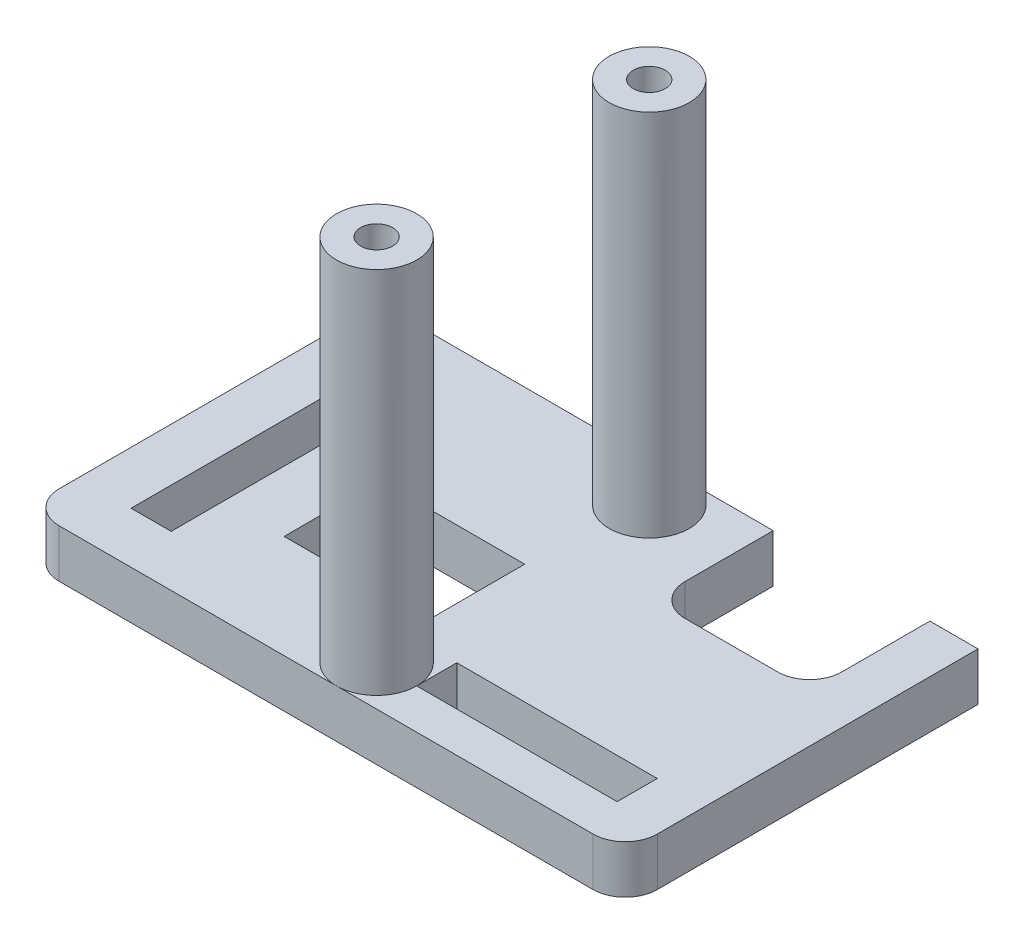
ISO-10303-21;
HEADER;
FILE_DESCRIPTION(('STEP AP214'),'2;1');
FILE_NAME('part.step','',(''),(''),'','','');
FILE_SCHEMA(('AUTOMOTIVE_DESIGN { 1 0 10303 214 1 1 1 1 }'));
ENDSEC;
DATA;
#1=APPLICATION_CONTEXT('core data for automotive mechanical design processes');
#2=APPLICATION_PROTOCOL_DEFINITION('international standard','automotive_design',2000,#1);
#3=PRODUCT_CONTEXT('',#1,'mechanical');
#4=PRODUCT('Part','Part','',(#3));
#5=PRODUCT_RELATED_PRODUCT_CATEGORY('part','',(#4));
#6=PRODUCT_DEFINITION_FORMATION('','',#4);
#7=PRODUCT_DEFINITION_CONTEXT('part definition',#1,'design');
#8=PRODUCT_DEFINITION('design','',#6,#7);
#9=PRODUCT_DEFINITION_SHAPE('','',#8);
#10=(LENGTH_UNIT() NAMED_UNIT(*) SI_UNIT(.MILLI.,.METRE.));
#11=(NAMED_UNIT(*) PLANE_ANGLE_UNIT() SI_UNIT($,.RADIAN.));
#12=(NAMED_UNIT(*) SI_UNIT($,.STERADIAN.) SOLID_ANGLE_UNIT());
#13=UNCERTAINTY_MEASURE_WITH_UNIT(LENGTH_MEASURE(1.E-05),#10,'distance_accuracy_value','');
#14=(GEOMETRIC_REPRESENTATION_CONTEXT(3) GLOBAL_UNCERTAINTY_ASSIGNED_CONTEXT((#13)) GLOBAL_UNIT_ASSIGNED_CONTEXT((#10,
#11,#12)) REPRESENTATION_CONTEXT('',''));
#15=CARTESIAN_POINT('',(0.,0.,0.));
#16=DIRECTION('',(0.,0.,1.));
#17=DIRECTION('',(1.,0.,0.));
#18=AXIS2_PLACEMENT_3D('',#15,#16,#17);
#19=CARTESIAN_POINT('',(0.,3.,0.));
#20=DIRECTION('',(0.,1.,0.));
#21=DIRECTION('',(0.,0.,1.));
#22=AXIS2_PLACEMENT_3D('',#19,#20,#21);
#23=PLANE('',#22);
#24=DIRECTION('',(1.,0.,0.));
#25=VECTOR('',#24,1.);
#26=CARTESIAN_POINT('',(0.,3.,18.9400374848537));
#27=LINE('',#26,#25);
#28=CARTESIAN_POINT('',(-35.2702207310731,3.,18.9400374848537));
#29=VERTEX_POINT('',#28);
#30=CARTESIAN_POINT('',(-32.7702207310731,3.,18.9400374848537));
#31=VERTEX_POINT('',#30);
#32=EDGE_CURVE('E272',#29,#31,#27,.T.);
#33=ORIENTED_EDGE('',*,*,#32,.T.);
#34=DIRECTION('',(0.,0.,1.));
#35=VECTOR('',#34,1.);
#36=CARTESIAN_POINT('',(-32.7702207310731,3.,0.));
#37=LINE('',#36,#35);
#38=CARTESIAN_POINT('',(-32.7702207310731,3.,31.4400374848537));
#39=VERTEX_POINT('',#38);
#40=EDGE_CURVE('E275',#31,#39,#37,.T.);
#41=ORIENTED_EDGE('',*,*,#40,.T.);
#42=DIRECTION('',(1.,0.,0.));
#43=VECTOR('',#42,1.);
#44=CARTESIAN_POINT('',(0.,3.,31.4400374848537));
#45=LINE('',#44,#43);
#46=CARTESIAN_POINT('',(-35.2702207310731,3.,31.4400374848537));
#47=VERTEX_POINT('',#46);
#48=EDGE_CURVE('E277',#47,#39,#45,.T.);
#49=ORIENTED_EDGE('',*,*,#48,.F.);
#50=DIRECTION('',(0.,0.,1.));
#51=VECTOR('',#50,1.);
#52=CARTESIAN_POINT('',(-35.2702207310731,3.,0.));
#53=LINE('',#52,#51);
#54=EDGE_CURVE('E280',#29,#47,#53,.T.);
#55=ORIENTED_EDGE('',*,*,#54,.F.);
#56=EDGE_LOOP('',(#33,#41,#49,#55));
#57=FACE_BOUND('',#56,.T.);
#58=DIRECTION('',(0.,0.,-1.));
#59=VECTOR('',#58,1.);
#60=CARTESIAN_POINT('',(-19.9759075065072,3.,0.));
#61=LINE('',#60,#59);
#62=CARTESIAN_POINT('',(-19.9759075065072,3.,28.1900374848538));
#63=VERTEX_POINT('',#62);
#64=CARTESIAN_POINT('',(-19.9759075065072,3.,22.1900374848537));
#65=VERTEX_POINT('',#64);
#66=EDGE_CURVE('E283',#63,#65,#61,.T.);
#67=ORIENTED_EDGE('',*,*,#66,.F.);
#68=DIRECTION('',(1.,0.,0.));
#69=VECTOR('',#68,1.);
#70=CARTESIAN_POINT('',(0.,3.,28.1900374848538));
#71=LINE('',#70,#69);
#72=CARTESIAN_POINT('',(-28.9759075065072,3.,28.1900374848537));
#73=VERTEX_POINT('',#72);
#74=EDGE_CURVE('E286',#73,#63,#71,.T.);
#75=ORIENTED_EDGE('',*,*,#74,.F.);
#76=DIRECTION('',(0.,0.,-1.));
#77=VECTOR('',#76,1.);
#78=CARTESIAN_POINT('',(-28.9759075065072,3.,0.));
#79=LINE('',#78,#77);
#80=CARTESIAN_POINT('',(-28.9759075065072,3.,22.1900374848537));
#81=VERTEX_POINT('',#80);
#82=EDGE_CURVE('E289',#73,#81,#79,.T.);
#83=ORIENTED_EDGE('',*,*,#82,.T.);
#84=DIRECTION('',(1.,0.,0.));
#85=VECTOR('',#84,1.);
#86=CARTESIAN_POINT('',(0.,3.,22.1900374848537));
#87=LINE('',#86,#85);
#88=EDGE_CURVE('E292',#81,#65,#87,.T.);
#89=ORIENTED_EDGE('',*,*,#88,.T.);
#90=EDGE_LOOP('',(#67,#75,#83,#89));
#91=FACE_BOUND('',#90,.T.);
#92=DIRECTION('',(1.,0.,0.));
#93=VECTOR('',#92,1.);
#94=CARTESIAN_POINT('',(0.,3.,34.6300374848537));
#95=LINE('',#94,#93);
#96=CARTESIAN_POINT('',(-36.561763485987,3.,34.6300374848537));
#97=VERTEX_POINT('',#96);
#98=CARTESIAN_POINT('',(-19.2702207310731,3.,34.6300374848537));
#99=VERTEX_POINT('',#98);
#100=EDGE_CURVE('E216',#97,#99,#95,.T.);
#101=ORIENTED_EDGE('',*,*,#100,.T.);
#102=CARTESIAN_POINT('',(-19.2702207310731,3.,32.1300374848537));
#103=DIRECTION('',(0.,1.,0.));
#104=DIRECTION('',(0.,0.,1.));
#105=AXIS2_PLACEMENT_3D('',#102,#103,#104);
#106=CIRCLE('',#105,2.5);
#107=CARTESIAN_POINT('',(-16.7702207310731,3.00000000000001,32.1300374848537));
#108=VERTEX_POINT('',#107);
#109=EDGE_CURVE('E48',#99,#108,#106,.F.);
#110=ORIENTED_EDGE('',*,*,#109,.T.);
#111=DIRECTION('',(0.,0.,-1.));
#112=VECTOR('',#111,1.);
#113=CARTESIAN_POINT('',(-16.7702207310731,3.,0.));
#114=LINE('',#113,#112);
#115=CARTESIAN_POINT('',(-16.7702207310731,3.,29.6300374848537));
#116=VERTEX_POINT('',#115);
#117=EDGE_CURVE('E213',#108,#116,#114,.T.);
#118=ORIENTED_EDGE('',*,*,#117,.T.);
#119=DIRECTION('',(1.,0.,0.));
#120=VECTOR('',#119,1.);
#121=CARTESIAN_POINT('',(0.,3.,29.6300374848537));
#122=LINE('',#121,#120);
#123=CARTESIAN_POINT('',(-4.2702207310731,3.,29.6300374848537));
#124=VERTEX_POINT('',#123);
#125=EDGE_CURVE('E235',#116,#124,#122,.T.);
#126=ORIENTED_EDGE('',*,*,#125,.T.);
#127=DIRECTION('',(0.,0.,-1.));
#128=VECTOR('',#127,1.);
#129=CARTESIAN_POINT('',(-4.2702207310731,3.,0.));
#130=LINE('',#129,#128);
#131=CARTESIAN_POINT('',(-4.2702207310731,3.,32.1300374848537));
#132=VERTEX_POINT('',#131);
#133=EDGE_CURVE('E238',#132,#124,#130,.T.);
#134=ORIENTED_EDGE('',*,*,#133,.F.);
#135=DIRECTION('',(1.,0.,0.));
#136=VECTOR('',#135,1.);
#137=CARTESIAN_POINT('',(0.,3.,32.1300374848537));
#138=LINE('',#137,#136);
#139=EDGE_CURVE('E223',#108,#132,#138,.T.);
#140=ORIENTED_EDGE('',*,*,#139,.F.);
#141=EDGE_CURVE('E202',#108,#99,#106,.F.);
#142=ORIENTED_EDGE('',*,*,#141,.T.);
#143=CARTESIAN_POINT('',(-3.2702207310731,3.,34.6300374848537));
#144=VERTEX_POINT('',#143);
#145=EDGE_CURVE('E256',#99,#144,#95,.T.);
#146=ORIENTED_EDGE('',*,*,#145,.T.);
#147=CARTESIAN_POINT('',(-3.2702207310731,3.,32.6300374848537));
#148=DIRECTION('',(0.,1.,0.));
#149=DIRECTION('',(0.,0.,1.));
#150=AXIS2_PLACEMENT_3D('',#147,#148,#149);
#151=CIRCLE('',#150,2.);
#152=CARTESIAN_POINT('',(-1.2702207310731,3.,32.6300374848537));
#153=VERTEX_POINT('',#152);
#154=EDGE_CURVE('E398',#144,#153,#151,.T.);
#155=ORIENTED_EDGE('',*,*,#154,.T.);
#156=DIRECTION('',(0.,0.,1.));
#157=VECTOR('',#156,1.);
#158=CARTESIAN_POINT('',(-1.2702207310731,3.,0.));
#159=LINE('',#158,#157);
#160=CARTESIAN_POINT('',(-1.2702207310731,3.,12.6300374848537));
#161=VERTEX_POINT('',#160);
#162=EDGE_CURVE('E258',#161,#153,#159,.T.);
#163=ORIENTED_EDGE('',*,*,#162,.F.);
#164=DIRECTION('',(1.,0.,0.));
#165=VECTOR('',#164,1.);
#166=CARTESIAN_POINT('',(0.,3.,12.6300374848537));
#167=LINE('',#166,#165);
#168=CARTESIAN_POINT('',(-4.2702207310731,3.,12.6300374848537));
#169=VERTEX_POINT('',#168);
#170=EDGE_CURVE('E261',#169,#161,#167,.T.);
#171=ORIENTED_EDGE('',*,*,#170,.F.);
#172=DIRECTION('',(0.,0.,-1.));
#173=VECTOR('',#172,1.);
#174=CARTESIAN_POINT('',(-4.2702207310731,3.,0.));
#175=LINE('',#174,#173);
#176=CARTESIAN_POINT('',(-4.2702207310731,3.,18.1214427198825));
#177=VERTEX_POINT('',#176);
#178=EDGE_CURVE('E264',#177,#169,#175,.T.);
#179=ORIENTED_EDGE('',*,*,#178,.F.);
#180=CARTESIAN_POINT('',(-6.2702207310731,3.,18.1214427198825));
#181=DIRECTION('',(0.,1.,0.));
#182=DIRECTION('',(0.,0.,1.));
#183=AXIS2_PLACEMENT_3D('',#180,#181,#182);
#184=CIRCLE('',#183,2.);
#185=CARTESIAN_POINT('',(-6.2702207310731,3.,20.1214427198825));
#186=VERTEX_POINT('',#185);
#187=EDGE_CURVE('E415',#177,#186,#184,.F.);
#188=ORIENTED_EDGE('',*,*,#187,.T.);
#189=DIRECTION('',(-1.,0.,0.));
#190=VECTOR('',#189,1.);
#191=CARTESIAN_POINT('',(0.,3.,20.1214427198825));
#192=LINE('',#191,#190);
#193=CARTESIAN_POINT('',(-12.0414444487504,3.,20.1214427198825));
#194=VERTEX_POINT('',#193);
#195=EDGE_CURVE('E266',#186,#194,#192,.T.);
#196=ORIENTED_EDGE('',*,*,#195,.T.);
#197=CARTESIAN_POINT('',(-12.0414444487504,3.,18.1214427198825));
#198=DIRECTION('',(0.,1.,0.));
#199=DIRECTION('',(0.,0.,1.));
#200=AXIS2_PLACEMENT_3D('',#197,#198,#199);
#201=CIRCLE('',#200,2.);
#202=CARTESIAN_POINT('',(-14.0414444487504,3.,18.1214427198825));
#203=VERTEX_POINT('',#202);
#204=EDGE_CURVE('E11',#194,#203,#201,.F.);
#205=ORIENTED_EDGE('',*,*,#204,.T.);
#206=DIRECTION('',(0.,0.,1.));
#207=VECTOR('',#206,1.);
#208=CARTESIAN_POINT('',(-14.0414444487504,3.,0.));
#209=LINE('',#208,#207);
#210=CARTESIAN_POINT('',(-14.0414444487504,3.,12.6300374848537));
#211=VERTEX_POINT('',#210);
#212=EDGE_CURVE('E269',#211,#203,#209,.T.);
#213=ORIENTED_EDGE('',*,*,#212,.F.);
#214=DIRECTION('',(1.,0.,0.));
#215=VECTOR('',#214,1.);
#216=CARTESIAN_POINT('',(0.,3.,12.6300374848537));
#217=LINE('',#216,#215);
#218=CARTESIAN_POINT('',(-19.2702207310731,3.,12.6300374848537));
#219=VERTEX_POINT('',#218);
#220=EDGE_CURVE('E249',#219,#211,#217,.T.);
#221=ORIENTED_EDGE('',*,*,#220,.F.);
#222=CARTESIAN_POINT('',(-19.2702207310731,3.,15.1300374848537));
#223=DIRECTION('',(0.,1.,0.));
#224=DIRECTION('',(0.,0.,1.));
#225=AXIS2_PLACEMENT_3D('',#222,#223,#224);
#226=CIRCLE('',#225,2.5);
#227=EDGE_CURVE('E54',#219,#219,#226,.F.);
#228=ORIENTED_EDGE('',*,*,#227,.T.);
#229=CARTESIAN_POINT('',(-36.561763485987,3.,12.6300374848537));
#230=VERTEX_POINT('',#229);
#231=EDGE_CURVE('E250',#230,#219,#217,.T.);
#232=ORIENTED_EDGE('',*,*,#231,.F.);
#233=CARTESIAN_POINT('',(-36.561763485987,3.,14.6300374848537));
#234=DIRECTION('',(0.,1.,0.));
#235=DIRECTION('',(0.,0.,1.));
#236=AXIS2_PLACEMENT_3D('',#233,#234,#235);
#237=CIRCLE('',#236,2.);
#238=CARTESIAN_POINT('',(-38.561763485987,3.,14.6300374848537));
#239=VERTEX_POINT('',#238);
#240=EDGE_CURVE('E402',#230,#239,#237,.T.);
#241=ORIENTED_EDGE('',*,*,#240,.T.);
#242=DIRECTION('',(0.,0.,1.));
#243=VECTOR('',#242,1.);
#244=CARTESIAN_POINT('',(-38.561763485987,3.,0.));
#245=LINE('',#244,#243);
#246=CARTESIAN_POINT('',(-38.561763485987,3.,32.6300374848537));
#247=VERTEX_POINT('',#246);
#248=EDGE_CURVE('E253',#239,#247,#245,.T.);
#249=ORIENTED_EDGE('',*,*,#248,.T.);
#250=CARTESIAN_POINT('',(-36.561763485987,3.,32.6300374848537));
#251=DIRECTION('',(0.,1.,0.));
#252=DIRECTION('',(0.,0.,1.));
#253=AXIS2_PLACEMENT_3D('',#250,#251,#252);
#254=CIRCLE('',#253,2.);
#255=EDGE_CURVE('E400',#247,#97,#254,.T.);
#256=ORIENTED_EDGE('',*,*,#255,.T.);
#257=EDGE_LOOP('',(#101,#110,#118,#126,#134,#140,#142,#146,#155,#163,#171,#179,#188,#196,#205,
#213,#221,#228,#232,#241,#249,#256));
#258=FACE_BOUND('',#257,.T.);
#259=ADVANCED_FACE('F34',(#57,#91,#258),#23,.T.);
#260=CARTESIAN_POINT('',(-19.9759075065072,3.,0.));
#261=DIRECTION('',(-1.,0.,0.));
#262=DIRECTION('',(0.,0.,1.));
#263=AXIS2_PLACEMENT_3D('',#260,#261,#262);
#264=PLANE('',#263);
#265=DIRECTION('',(0.,0.,-1.));
#266=VECTOR('',#265,1.);
#267=CARTESIAN_POINT('',(-19.9759075065072,0.,0.));
#268=LINE('',#267,#266);
#269=CARTESIAN_POINT('',(-19.9759075065072,0.,28.1900374848538));
#270=VERTEX_POINT('',#269);
#271=CARTESIAN_POINT('',(-19.9759075065072,0.,22.1900374848537));
#272=VERTEX_POINT('',#271);
#273=EDGE_CURVE('E337',#270,#272,#268,.T.);
#274=ORIENTED_EDGE('',*,*,#273,.F.);
#275=DIRECTION('',(0.,-1.,0.));
#276=VECTOR('',#275,1.);
#277=CARTESIAN_POINT('',(-19.9759075065072,3.,28.1900374848538));
#278=LINE('',#277,#276);
#279=EDGE_CURVE('E353',#63,#270,#278,.T.);
#280=ORIENTED_EDGE('',*,*,#279,.F.);
#281=ORIENTED_EDGE('',*,*,#66,.T.);
#282=DIRECTION('',(0.,-1.,0.));
#283=VECTOR('',#282,1.);
#284=CARTESIAN_POINT('',(-19.9759075065072,3.,22.1900374848537));
#285=LINE('',#284,#283);
#286=EDGE_CURVE('E345',#65,#272,#285,.T.);
#287=ORIENTED_EDGE('',*,*,#286,.T.);
#288=EDGE_LOOP('',(#274,#280,#281,#287));
#289=FACE_BOUND('',#288,.T.);
#290=ADVANCED_FACE('F481',(#289),#264,.T.);
#291=CARTESIAN_POINT('',(0.,3.,28.1900374848538));
#292=DIRECTION('',(0.,0.,-1.));
#293=DIRECTION('',(-1.,0.,0.));
#294=AXIS2_PLACEMENT_3D('',#291,#292,#293);
#295=PLANE('',#294);
#296=DIRECTION('',(1.,0.,0.));
#297=VECTOR('',#296,1.);
#298=CARTESIAN_POINT('',(0.,0.,28.1900374848538));
#299=LINE('',#298,#297);
#300=CARTESIAN_POINT('',(-28.9759075065072,0.,28.1900374848537));
#301=VERTEX_POINT('',#300);
#302=EDGE_CURVE('E340',#301,#270,#299,.T.);
#303=ORIENTED_EDGE('',*,*,#302,.F.);
#304=DIRECTION('',(0.,-1.,0.));
#305=VECTOR('',#304,1.);
#306=CARTESIAN_POINT('',(-28.9759075065072,3.,28.1900374848537));
#307=LINE('',#306,#305);
#308=EDGE_CURVE('E351',#73,#301,#307,.T.);
#309=ORIENTED_EDGE('',*,*,#308,.F.);
#310=ORIENTED_EDGE('',*,*,#74,.T.);
#311=ORIENTED_EDGE('',*,*,#279,.T.);
#312=EDGE_LOOP('',(#303,#309,#310,#311));
#313=FACE_BOUND('',#312,.T.);
#314=ADVANCED_FACE('F487',(#313),#295,.T.);
#315=CARTESIAN_POINT('',(-28.9759075065072,3.,0.));
#316=DIRECTION('',(-1.,0.,0.));
#317=DIRECTION('',(0.,0.,1.));
#318=AXIS2_PLACEMENT_3D('',#315,#316,#317);
#319=PLANE('',#318);
#320=DIRECTION('',(0.,0.,-1.));
#321=VECTOR('',#320,1.);
#322=CARTESIAN_POINT('',(-28.9759075065072,0.,0.));
#323=LINE('',#322,#321);
#324=CARTESIAN_POINT('',(-28.9759075065072,0.,22.1900374848537));
#325=VERTEX_POINT('',#324);
#326=EDGE_CURVE('E242',#301,#325,#323,.T.);
#327=ORIENTED_EDGE('',*,*,#326,.T.);
#328=DIRECTION('',(0.,-1.,0.));
#329=VECTOR('',#328,1.);
#330=CARTESIAN_POINT('',(-28.9759075065072,3.,22.1900374848537));
#331=LINE('',#330,#329);
#332=EDGE_CURVE('E347',#81,#325,#331,.T.);
#333=ORIENTED_EDGE('',*,*,#332,.F.);
#334=ORIENTED_EDGE('',*,*,#82,.F.);
#335=ORIENTED_EDGE('',*,*,#308,.T.);
#336=EDGE_LOOP('',(#327,#333,#334,#335));
#337=FACE_BOUND('',#336,.T.);
#338=ADVANCED_FACE('F501',(#337),#319,.F.);
#339=CARTESIAN_POINT('',(0.,3.,18.9400374848537));
#340=DIRECTION('',(0.,0.,-1.));
#341=DIRECTION('',(-1.,0.,0.));
#342=AXIS2_PLACEMENT_3D('',#339,#340,#341);
#343=PLANE('',#342);
#344=DIRECTION('',(1.,0.,0.));
#345=VECTOR('',#344,1.);
#346=CARTESIAN_POINT('',(0.,0.,18.9400374848537));
#347=LINE('',#346,#345);
#348=CARTESIAN_POINT('',(-35.2702207310731,0.,18.9400374848537));
#349=VERTEX_POINT('',#348);
#350=CARTESIAN_POINT('',(-32.7702207310731,0.,18.9400374848537));
#351=VERTEX_POINT('',#350);
#352=EDGE_CURVE('E325',#349,#351,#347,.T.);
#353=ORIENTED_EDGE('',*,*,#352,.T.);
#354=DIRECTION('',(0.,-1.,0.));
#355=VECTOR('',#354,1.);
#356=CARTESIAN_POINT('',(-32.7702207310731,3.,18.9400374848537));
#357=LINE('',#356,#355);
#358=EDGE_CURVE('E348',#31,#351,#357,.T.);
#359=ORIENTED_EDGE('',*,*,#358,.F.);
#360=ORIENTED_EDGE('',*,*,#32,.F.);
#361=DIRECTION('',(0.,-1.,0.));
#362=VECTOR('',#361,1.);
#363=CARTESIAN_POINT('',(-35.2702207310731,3.,18.9400374848537));
#364=LINE('',#363,#362);
#365=EDGE_CURVE('E356',#29,#349,#364,.T.);
#366=ORIENTED_EDGE('',*,*,#365,.T.);
#367=EDGE_LOOP('',(#353,#359,#360,#366));
#368=FACE_BOUND('',#367,.T.);
#369=ADVANCED_FACE('F504',(#368),#343,.F.);
#370=CARTESIAN_POINT('',(-32.7702207310731,3.,0.));
#371=DIRECTION('',(1.,0.,0.));
#372=DIRECTION('',(0.,0.,-1.));
#373=AXIS2_PLACEMENT_3D('',#370,#371,#372);
#374=PLANE('',#373);
#375=DIRECTION('',(0.,0.,1.));
#376=VECTOR('',#375,1.);
#377=CARTESIAN_POINT('',(-32.7702207310731,0.,0.));
#378=LINE('',#377,#376);
#379=CARTESIAN_POINT('',(-32.7702207310731,0.,31.4400374848537));
#380=VERTEX_POINT('',#379);
#381=EDGE_CURVE('E328',#351,#380,#378,.T.);
#382=ORIENTED_EDGE('',*,*,#381,.T.);
#383=DIRECTION('',(0.,-1.,0.));
#384=VECTOR('',#383,1.);
#385=CARTESIAN_POINT('',(-32.7702207310731,3.,31.4400374848537));
#386=LINE('',#385,#384);
#387=EDGE_CURVE('E361',#39,#380,#386,.T.);
#388=ORIENTED_EDGE('',*,*,#387,.F.);
#389=ORIENTED_EDGE('',*,*,#40,.F.);
#390=ORIENTED_EDGE('',*,*,#358,.T.);
#391=EDGE_LOOP('',(#382,#388,#389,#390));
#392=FACE_BOUND('',#391,.T.);
#393=ADVANCED_FACE('F517',(#392),#374,.F.);
#394=CARTESIAN_POINT('',(0.,3.,31.4400374848537));
#395=DIRECTION('',(0.,0.,-1.));
#396=DIRECTION('',(-1.,0.,0.));
#397=AXIS2_PLACEMENT_3D('',#394,#395,#396);
#398=PLANE('',#397);
#399=DIRECTION('',(1.,0.,0.));
#400=VECTOR('',#399,1.);
#401=CARTESIAN_POINT('',(0.,0.,31.4400374848537));
#402=LINE('',#401,#400);
#403=CARTESIAN_POINT('',(-35.2702207310731,0.,31.4400374848537));
#404=VERTEX_POINT('',#403);
#405=EDGE_CURVE('E331',#404,#380,#402,.T.);
#406=ORIENTED_EDGE('',*,*,#405,.F.);
#407=DIRECTION('',(0.,-1.,0.));
#408=VECTOR('',#407,1.);
#409=CARTESIAN_POINT('',(-35.2702207310731,3.,31.4400374848537));
#410=LINE('',#409,#408);
#411=EDGE_CURVE('E358',#47,#404,#410,.T.);
#412=ORIENTED_EDGE('',*,*,#411,.F.);
#413=ORIENTED_EDGE('',*,*,#48,.T.);
#414=ORIENTED_EDGE('',*,*,#387,.T.);
#415=EDGE_LOOP('',(#406,#412,#413,#414));
#416=FACE_BOUND('',#415,.T.);
#417=ADVANCED_FACE('F514',(#416),#398,.T.);
#418=CARTESIAN_POINT('',(0.,3.,12.6300374848537));
#419=DIRECTION('',(0.,0.,-1.));
#420=DIRECTION('',(-1.,0.,0.));
#421=AXIS2_PLACEMENT_3D('',#418,#419,#420);
#422=PLANE('',#421);
#423=ORIENTED_EDGE('',*,*,#231,.T.);
#424=ORIENTED_EDGE('',*,*,#220,.T.);
#425=DIRECTION('',(0.,-1.,0.));
#426=VECTOR('',#425,1.);
#427=CARTESIAN_POINT('',(-14.0414444487504,3.,12.6300374848537));
#428=LINE('',#427,#426);
#429=CARTESIAN_POINT('',(-14.0414444487504,0.,12.6300374848537));
#430=VERTEX_POINT('',#429);
#431=EDGE_CURVE('E229',#211,#430,#428,.T.);
#432=ORIENTED_EDGE('',*,*,#431,.T.);
#433=DIRECTION('',(1.,0.,0.));
#434=VECTOR('',#433,1.);
#435=CARTESIAN_POINT('',(0.,0.,12.6300374848537));
#436=LINE('',#435,#434);
#437=CARTESIAN_POINT('',(-36.561763485987,0.,12.6300374848537));
#438=VERTEX_POINT('',#437);
#439=EDGE_CURVE('E304',#438,#430,#436,.T.);
#440=ORIENTED_EDGE('',*,*,#439,.F.);
#441=DIRECTION('',(0.,-1.,0.));
#442=VECTOR('',#441,1.);
#443=CARTESIAN_POINT('',(-36.561763485987,3.,12.6300374848537));
#444=LINE('',#443,#442);
#445=EDGE_CURVE('E396',#438,#230,#444,.F.);
#446=ORIENTED_EDGE('',*,*,#445,.T.);
#447=EDGE_LOOP('',(#423,#424,#432,#440,#446));
#448=FACE_BOUND('',#447,.T.);
#449=ADVANCED_FACE('F437',(#448),#422,.T.);
#450=CARTESIAN_POINT('',(-38.561763485987,3.,0.));
#451=DIRECTION('',(1.,0.,0.));
#452=DIRECTION('',(0.,0.,-1.));
#453=AXIS2_PLACEMENT_3D('',#450,#451,#452);
#454=PLANE('',#453);
#455=ORIENTED_EDGE('',*,*,#248,.F.);
#456=DIRECTION('',(0.,-1.,0.));
#457=VECTOR('',#456,1.);
#458=CARTESIAN_POINT('',(-38.561763485987,0.,14.6300374848537));
#459=LINE('',#458,#457);
#460=CARTESIAN_POINT('',(-38.561763485987,0.,14.6300374848537));
#461=VERTEX_POINT('',#460);
#462=EDGE_CURVE('E386',#239,#461,#459,.T.);
#463=ORIENTED_EDGE('',*,*,#462,.T.);
#464=DIRECTION('',(0.,0.,1.));
#465=VECTOR('',#464,1.);
#466=CARTESIAN_POINT('',(-38.561763485987,0.,0.));
#467=LINE('',#466,#465);
#468=CARTESIAN_POINT('',(-38.561763485987,0.,32.6300374848537));
#469=VERTEX_POINT('',#468);
#470=EDGE_CURVE('E306',#461,#469,#467,.T.);
#471=ORIENTED_EDGE('',*,*,#470,.T.);
#472=DIRECTION('',(0.,-1.,0.));
#473=VECTOR('',#472,1.);
#474=CARTESIAN_POINT('',(-38.561763485987,3.,32.6300374848537));
#475=LINE('',#474,#473);
#476=EDGE_CURVE('E384',#469,#247,#475,.F.);
#477=ORIENTED_EDGE('',*,*,#476,.T.);
#478=EDGE_LOOP('',(#455,#463,#471,#477));
#479=FACE_BOUND('',#478,.T.);
#480=ADVANCED_FACE('F544',(#479),#454,.F.);
#481=CARTESIAN_POINT('',(0.,3.,34.6300374848537));
#482=DIRECTION('',(0.,0.,-1.));
#483=DIRECTION('',(-1.,0.,0.));
#484=AXIS2_PLACEMENT_3D('',#481,#482,#483);
#485=PLANE('',#484);
#486=DIRECTION('',(1.,0.,0.));
#487=VECTOR('',#486,1.);
#488=CARTESIAN_POINT('',(0.,0.,34.6300374848537));
#489=LINE('',#488,#487);
#490=CARTESIAN_POINT('',(-36.561763485987,0.,34.6300374848537));
#491=VERTEX_POINT('',#490);
#492=CARTESIAN_POINT('',(-3.2702207310731,0.,34.6300374848537));
#493=VERTEX_POINT('',#492);
#494=EDGE_CURVE('E309',#491,#493,#489,.T.);
#495=ORIENTED_EDGE('',*,*,#494,.T.);
#496=DIRECTION('',(0.,-1.,0.));
#497=VECTOR('',#496,1.);
#498=CARTESIAN_POINT('',(-3.2702207310731,3.,34.6300374848537));
#499=LINE('',#498,#497);
#500=EDGE_CURVE('E404',#493,#144,#499,.F.);
#501=ORIENTED_EDGE('',*,*,#500,.T.);
#502=ORIENTED_EDGE('',*,*,#145,.F.);
#503=ORIENTED_EDGE('',*,*,#100,.F.);
#504=DIRECTION('',(0.,-1.,0.));
#505=VECTOR('',#504,1.);
#506=CARTESIAN_POINT('',(-36.561763485987,3.,34.6300374848537));
#507=LINE('',#506,#505);
#508=EDGE_CURVE('E407',#97,#491,#507,.T.);
#509=ORIENTED_EDGE('',*,*,#508,.T.);
#510=EDGE_LOOP('',(#495,#501,#502,#503,#509));
#511=FACE_BOUND('',#510,.T.);
#512=ADVANCED_FACE('F540',(#511),#485,.F.);
#513=CARTESIAN_POINT('',(-1.2702207310731,3.,0.));
#514=DIRECTION('',(1.,0.,0.));
#515=DIRECTION('',(0.,0.,-1.));
#516=AXIS2_PLACEMENT_3D('',#513,#514,#515);
#517=PLANE('',#516);
#518=ORIENTED_EDGE('',*,*,#162,.T.);
#519=DIRECTION('',(0.,-1.,0.));
#520=VECTOR('',#519,1.);
#521=CARTESIAN_POINT('',(-1.2702207310731,0.,32.6300374848537));
#522=LINE('',#521,#520);
#523=CARTESIAN_POINT('',(-1.2702207310731,0.,32.6300374848537));
#524=VERTEX_POINT('',#523);
#525=EDGE_CURVE('E410',#153,#524,#522,.T.);
#526=ORIENTED_EDGE('',*,*,#525,.T.);
#527=DIRECTION('',(0.,0.,1.));
#528=VECTOR('',#527,1.);
#529=CARTESIAN_POINT('',(-1.2702207310731,0.,0.));
#530=LINE('',#529,#528);
#531=CARTESIAN_POINT('',(-1.2702207310731,0.,12.6300374848537));
#532=VERTEX_POINT('',#531);
#533=EDGE_CURVE('E311',#532,#524,#530,.T.);
#534=ORIENTED_EDGE('',*,*,#533,.F.);
#535=DIRECTION('',(0.,-1.,0.));
#536=VECTOR('',#535,1.);
#537=CARTESIAN_POINT('',(-1.2702207310731,3.,12.6300374848537));
#538=LINE('',#537,#536);
#539=EDGE_CURVE('E359',#161,#532,#538,.T.);
#540=ORIENTED_EDGE('',*,*,#539,.F.);
#541=EDGE_LOOP('',(#518,#526,#534,#540));
#542=FACE_BOUND('',#541,.T.);
#543=ADVANCED_FACE('F536',(#542),#517,.T.);
#544=CARTESIAN_POINT('',(0.,3.,12.6300374848537));
#545=DIRECTION('',(0.,0.,-1.));
#546=DIRECTION('',(-1.,0.,0.));
#547=AXIS2_PLACEMENT_3D('',#544,#545,#546);
#548=PLANE('',#547);
#549=DIRECTION('',(1.,0.,0.));
#550=VECTOR('',#549,1.);
#551=CARTESIAN_POINT('',(0.,0.,12.6300374848537));
#552=LINE('',#551,#550);
#553=CARTESIAN_POINT('',(-4.2702207310731,0.,12.6300374848537));
#554=VERTEX_POINT('',#553);
#555=EDGE_CURVE('E314',#554,#532,#552,.T.);
#556=ORIENTED_EDGE('',*,*,#555,.F.);
#557=DIRECTION('',(0.,-1.,0.));
#558=VECTOR('',#557,1.);
#559=CARTESIAN_POINT('',(-4.2702207310731,3.,12.6300374848537));
#560=LINE('',#559,#558);
#561=EDGE_CURVE('E367',#169,#554,#560,.T.);
#562=ORIENTED_EDGE('',*,*,#561,.F.);
#563=ORIENTED_EDGE('',*,*,#170,.T.);
#564=ORIENTED_EDGE('',*,*,#539,.T.);
#565=EDGE_LOOP('',(#556,#562,#563,#564));
#566=FACE_BOUND('',#565,.T.);
#567=ADVANCED_FACE('F532',(#566),#548,.T.);
#568=CARTESIAN_POINT('',(-4.2702207310731,3.,0.));
#569=DIRECTION('',(-1.,0.,0.));
#570=DIRECTION('',(0.,0.,1.));
#571=AXIS2_PLACEMENT_3D('',#568,#569,#570);
#572=PLANE('',#571);
#573=DIRECTION('',(0.,0.,-1.));
#574=VECTOR('',#573,1.);
#575=CARTESIAN_POINT('',(-4.2702207310731,0.,0.));
#576=LINE('',#575,#574);
#577=CARTESIAN_POINT('',(-4.2702207310731,0.,18.1214427198825));
#578=VERTEX_POINT('',#577);
#579=EDGE_CURVE('E317',#578,#554,#576,.T.);
#580=ORIENTED_EDGE('',*,*,#579,.F.);
#581=DIRECTION('',(0.,-1.,0.));
#582=VECTOR('',#581,1.);
#583=CARTESIAN_POINT('',(-4.2702207310731,3.,18.1214427198825));
#584=LINE('',#583,#582);
#585=EDGE_CURVE('E379',#578,#177,#584,.F.);
#586=ORIENTED_EDGE('',*,*,#585,.T.);
#587=ORIENTED_EDGE('',*,*,#178,.T.);
#588=ORIENTED_EDGE('',*,*,#561,.T.);
#589=EDGE_LOOP('',(#580,#586,#587,#588));
#590=FACE_BOUND('',#589,.T.);
#591=ADVANCED_FACE('F529',(#590),#572,.T.);
#592=CARTESIAN_POINT('',(0.,3.,20.1214427198825));
#593=DIRECTION('',(0.,0.,1.));
#594=DIRECTION('',(1.,0.,0.));
#595=AXIS2_PLACEMENT_3D('',#592,#593,#594);
#596=PLANE('',#595);
#597=ORIENTED_EDGE('',*,*,#195,.F.);
#598=DIRECTION('',(0.,-1.,0.));
#599=VECTOR('',#598,1.);
#600=CARTESIAN_POINT('',(-6.2702207310731,3.,20.1214427198825));
#601=LINE('',#600,#599);
#602=CARTESIAN_POINT('',(-6.2702207310731,0.,20.1214427198825));
#603=VERTEX_POINT('',#602);
#604=EDGE_CURVE('E376',#186,#603,#601,.T.);
#605=ORIENTED_EDGE('',*,*,#604,.T.);
#606=DIRECTION('',(-1.,0.,0.));
#607=VECTOR('',#606,1.);
#608=CARTESIAN_POINT('',(0.,0.,20.1214427198825));
#609=LINE('',#608,#607);
#610=CARTESIAN_POINT('',(-12.0414444487504,0.,20.1214427198825));
#611=VERTEX_POINT('',#610);
#612=EDGE_CURVE('E319',#603,#611,#609,.T.);
#613=ORIENTED_EDGE('',*,*,#612,.T.);
#614=DIRECTION('',(0.,-1.,0.));
#615=VECTOR('',#614,1.);
#616=CARTESIAN_POINT('',(-12.0414444487504,3.,20.1214427198825));
#617=LINE('',#616,#615);
#618=EDGE_CURVE('E355',#611,#194,#617,.F.);
#619=ORIENTED_EDGE('',*,*,#618,.T.);
#620=EDGE_LOOP('',(#597,#605,#613,#619));
#621=FACE_BOUND('',#620,.T.);
#622=ADVANCED_FACE('F426',(#621),#596,.F.);
#623=CARTESIAN_POINT('',(0.,3.,32.1300374848537));
#624=DIRECTION('',(0.,0.,-1.));
#625=DIRECTION('',(-1.,0.,0.));
#626=AXIS2_PLACEMENT_3D('',#623,#624,#625);
#627=PLANE('',#626);
#628=DIRECTION('',(1.,0.,0.));
#629=VECTOR('',#628,1.);
#630=CARTESIAN_POINT('',(0.,0.,32.1300374848537));
#631=LINE('',#630,#629);
#632=CARTESIAN_POINT('',(-16.7702207310731,0.,32.1300374848537));
#633=VERTEX_POINT('',#632);
#634=CARTESIAN_POINT('',(-4.2702207310731,0.,32.1300374848537));
#635=VERTEX_POINT('',#634);
#636=EDGE_CURVE('E226',#633,#635,#631,.T.);
#637=ORIENTED_EDGE('',*,*,#636,.F.);
#638=DIRECTION('',(0.,-1.,0.));
#639=VECTOR('',#638,1.);
#640=CARTESIAN_POINT('',(-16.7702207310731,3.,32.1300374848537));
#641=LINE('',#640,#639);
#642=EDGE_CURVE('E221',#108,#633,#641,.T.);
#643=ORIENTED_EDGE('',*,*,#642,.F.);
#644=ORIENTED_EDGE('',*,*,#139,.T.);
#645=DIRECTION('',(0.,-1.,0.));
#646=VECTOR('',#645,1.);
#647=CARTESIAN_POINT('',(-4.2702207310731,3.,32.1300374848537));
#648=LINE('',#647,#646);
#649=EDGE_CURVE('E294',#132,#635,#648,.T.);
#650=ORIENTED_EDGE('',*,*,#649,.T.);
#651=EDGE_LOOP('',(#637,#643,#644,#650));
#652=FACE_BOUND('',#651,.T.);
#653=ADVANCED_FACE('F222',(#652),#627,.T.);
#654=CARTESIAN_POINT('',(-16.7702207310731,3.,0.));
#655=DIRECTION('',(-1.,0.,0.));
#656=DIRECTION('',(0.,0.,1.));
#657=AXIS2_PLACEMENT_3D('',#654,#655,#656);
#658=PLANE('',#657);
#659=DIRECTION('',(0.,0.,-1.));
#660=VECTOR('',#659,1.);
#661=CARTESIAN_POINT('',(-16.7702207310731,0.,0.));
#662=LINE('',#661,#660);
#663=CARTESIAN_POINT('',(-16.7702207310731,0.,29.6300374848537));
#664=VERTEX_POINT('',#663);
#665=EDGE_CURVE('E296',#633,#664,#662,.T.);
#666=ORIENTED_EDGE('',*,*,#665,.T.);
#667=DIRECTION('',(0.,-1.,0.));
#668=VECTOR('',#667,1.);
#669=CARTESIAN_POINT('',(-16.7702207310731,3.,29.6300374848537));
#670=LINE('',#669,#668);
#671=EDGE_CURVE('E230',#116,#664,#670,.T.);
#672=ORIENTED_EDGE('',*,*,#671,.F.);
#673=ORIENTED_EDGE('',*,*,#117,.F.);
#674=ORIENTED_EDGE('',*,*,#642,.T.);
#675=EDGE_LOOP('',(#666,#672,#673,#674));
#676=FACE_BOUND('',#675,.T.);
#677=ADVANCED_FACE('F232',(#676),#658,.F.);
#678=CARTESIAN_POINT('',(0.,3.,29.6300374848537));
#679=DIRECTION('',(0.,0.,-1.));
#680=DIRECTION('',(-1.,0.,0.));
#681=AXIS2_PLACEMENT_3D('',#678,#679,#680);
#682=PLANE('',#681);
#683=DIRECTION('',(1.,0.,0.));
#684=VECTOR('',#683,1.);
#685=CARTESIAN_POINT('',(0.,0.,29.6300374848537));
#686=LINE('',#685,#684);
#687=CARTESIAN_POINT('',(-4.2702207310731,0.,29.6300374848537));
#688=VERTEX_POINT('',#687);
#689=EDGE_CURVE('E298',#664,#688,#686,.T.);
#690=ORIENTED_EDGE('',*,*,#689,.T.);
#691=DIRECTION('',(0.,-1.,0.));
#692=VECTOR('',#691,1.);
#693=CARTESIAN_POINT('',(-4.2702207310731,3.,29.6300374848537));
#694=LINE('',#693,#692);
#695=EDGE_CURVE('E372',#124,#688,#694,.T.);
#696=ORIENTED_EDGE('',*,*,#695,.F.);
#697=ORIENTED_EDGE('',*,*,#125,.F.);
#698=ORIENTED_EDGE('',*,*,#671,.T.);
#699=EDGE_LOOP('',(#690,#696,#697,#698));
#700=FACE_BOUND('',#699,.T.);
#701=ADVANCED_FACE('F512',(#700),#682,.F.);
#702=CARTESIAN_POINT('',(-35.2702207310731,3.,0.));
#703=DIRECTION('',(1.,0.,0.));
#704=DIRECTION('',(0.,0.,-1.));
#705=AXIS2_PLACEMENT_3D('',#702,#703,#704);
#706=PLANE('',#705);
#707=DIRECTION('',(0.,0.,1.));
#708=VECTOR('',#707,1.);
#709=CARTESIAN_POINT('',(-35.2702207310731,0.,0.));
#710=LINE('',#709,#708);
#711=EDGE_CURVE('E334',#349,#404,#710,.T.);
#712=ORIENTED_EDGE('',*,*,#711,.F.);
#713=ORIENTED_EDGE('',*,*,#365,.F.);
#714=ORIENTED_EDGE('',*,*,#54,.T.);
#715=ORIENTED_EDGE('',*,*,#411,.T.);
#716=EDGE_LOOP('',(#712,#713,#714,#715));
#717=FACE_BOUND('',#716,.T.);
#718=ADVANCED_FACE('F509',(#717),#706,.T.);
#719=CARTESIAN_POINT('',(-14.0414444487504,3.,0.));
#720=DIRECTION('',(1.,0.,0.));
#721=DIRECTION('',(0.,0.,-1.));
#722=AXIS2_PLACEMENT_3D('',#719,#720,#721);
#723=PLANE('',#722);
#724=ORIENTED_EDGE('',*,*,#212,.T.);
#725=DIRECTION('',(0.,-1.,0.));
#726=VECTOR('',#725,1.);
#727=CARTESIAN_POINT('',(-14.0414444487504,3.,18.1214427198825));
#728=LINE('',#727,#726);
#729=CARTESIAN_POINT('',(-14.0414444487504,0.,18.1214427198825));
#730=VERTEX_POINT('',#729);
#731=EDGE_CURVE('E381',#203,#730,#728,.T.);
#732=ORIENTED_EDGE('',*,*,#731,.T.);
#733=DIRECTION('',(0.,0.,1.));
#734=VECTOR('',#733,1.);
#735=CARTESIAN_POINT('',(-14.0414444487504,0.,0.));
#736=LINE('',#735,#734);
#737=EDGE_CURVE('E322',#430,#730,#736,.T.);
#738=ORIENTED_EDGE('',*,*,#737,.F.);
#739=ORIENTED_EDGE('',*,*,#431,.F.);
#740=EDGE_LOOP('',(#724,#732,#738,#739));
#741=FACE_BOUND('',#740,.T.);
#742=ADVANCED_FACE('F434',(#741),#723,.T.);
#743=CARTESIAN_POINT('',(-4.2702207310731,3.,0.));
#744=DIRECTION('',(-1.,0.,0.));
#745=DIRECTION('',(0.,0.,1.));
#746=AXIS2_PLACEMENT_3D('',#743,#744,#745);
#747=PLANE('',#746);
#748=DIRECTION('',(0.,0.,-1.));
#749=VECTOR('',#748,1.);
#750=CARTESIAN_POINT('',(-4.2702207310731,0.,0.));
#751=LINE('',#750,#749);
#752=EDGE_CURVE('E301',#635,#688,#751,.T.);
#753=ORIENTED_EDGE('',*,*,#752,.F.);
#754=ORIENTED_EDGE('',*,*,#649,.F.);
#755=ORIENTED_EDGE('',*,*,#133,.T.);
#756=ORIENTED_EDGE('',*,*,#695,.T.);
#757=EDGE_LOOP('',(#753,#754,#755,#756));
#758=FACE_BOUND('',#757,.T.);
#759=ADVANCED_FACE('F499',(#758),#747,.T.);
#760=CARTESIAN_POINT('',(0.,3.,22.1900374848537));
#761=DIRECTION('',(0.,0.,-1.));
#762=DIRECTION('',(-1.,0.,0.));
#763=AXIS2_PLACEMENT_3D('',#760,#761,#762);
#764=PLANE('',#763);
#765=DIRECTION('',(1.,0.,0.));
#766=VECTOR('',#765,1.);
#767=CARTESIAN_POINT('',(0.,0.,22.1900374848537));
#768=LINE('',#767,#766);
#769=EDGE_CURVE('E239',#325,#272,#768,.T.);
#770=ORIENTED_EDGE('',*,*,#769,.T.);
#771=ORIENTED_EDGE('',*,*,#286,.F.);
#772=ORIENTED_EDGE('',*,*,#88,.F.);
#773=ORIENTED_EDGE('',*,*,#332,.T.);
#774=EDGE_LOOP('',(#770,#771,#772,#773));
#775=FACE_BOUND('',#774,.T.);
#776=ADVANCED_FACE('F495',(#775),#764,.F.);
#777=CARTESIAN_POINT('',(0.,0.,0.));
#778=DIRECTION('',(0.,1.,0.));
#779=DIRECTION('',(0.,0.,1.));
#780=AXIS2_PLACEMENT_3D('',#777,#778,#779);
#781=PLANE('',#780);
#782=ORIENTED_EDGE('',*,*,#665,.F.);
#783=ORIENTED_EDGE('',*,*,#636,.T.);
#784=ORIENTED_EDGE('',*,*,#752,.T.);
#785=ORIENTED_EDGE('',*,*,#689,.F.);
#786=EDGE_LOOP('',(#782,#783,#784,#785));
#787=FACE_BOUND('',#786,.T.);
#788=CARTESIAN_POINT('',(-3.2702207310731,0.,32.6300374848537));
#789=DIRECTION('',(0.,1.,0.));
#790=DIRECTION('',(0.,0.,1.));
#791=AXIS2_PLACEMENT_3D('',#788,#789,#790);
#792=CIRCLE('',#791,2.);
#793=EDGE_CURVE('E389',#524,#493,#792,.F.);
#794=ORIENTED_EDGE('',*,*,#793,.T.);
#795=ORIENTED_EDGE('',*,*,#494,.F.);
#796=CARTESIAN_POINT('',(-36.561763485987,0.,32.6300374848537));
#797=DIRECTION('',(0.,1.,0.));
#798=DIRECTION('',(0.,0.,1.));
#799=AXIS2_PLACEMENT_3D('',#796,#797,#798);
#800=CIRCLE('',#799,2.);
#801=EDGE_CURVE('E392',#491,#469,#800,.F.);
#802=ORIENTED_EDGE('',*,*,#801,.T.);
#803=ORIENTED_EDGE('',*,*,#470,.F.);
#804=CARTESIAN_POINT('',(-36.561763485987,0.,14.6300374848537));
#805=DIRECTION('',(0.,1.,0.));
#806=DIRECTION('',(0.,0.,1.));
#807=AXIS2_PLACEMENT_3D('',#804,#805,#806);
#808=CIRCLE('',#807,2.);
#809=EDGE_CURVE('E394',#461,#438,#808,.F.);
#810=ORIENTED_EDGE('',*,*,#809,.T.);
#811=ORIENTED_EDGE('',*,*,#439,.T.);
#812=ORIENTED_EDGE('',*,*,#737,.T.);
#813=CARTESIAN_POINT('',(-12.0414444487504,0.,18.1214427198825));
#814=DIRECTION('',(0.,1.,0.));
#815=DIRECTION('',(0.,0.,1.));
#816=AXIS2_PLACEMENT_3D('',#813,#814,#815);
#817=CIRCLE('',#816,2.);
#818=EDGE_CURVE('E42',#730,#611,#817,.T.);
#819=ORIENTED_EDGE('',*,*,#818,.T.);
#820=ORIENTED_EDGE('',*,*,#612,.F.);
#821=CARTESIAN_POINT('',(-6.2702207310731,0.,18.1214427198825));
#822=DIRECTION('',(0.,1.,0.));
#823=DIRECTION('',(0.,0.,1.));
#824=AXIS2_PLACEMENT_3D('',#821,#822,#823);
#825=CIRCLE('',#824,2.);
#826=EDGE_CURVE('E413',#603,#578,#825,.T.);
#827=ORIENTED_EDGE('',*,*,#826,.T.);
#828=ORIENTED_EDGE('',*,*,#579,.T.);
#829=ORIENTED_EDGE('',*,*,#555,.T.);
#830=ORIENTED_EDGE('',*,*,#533,.T.);
#831=EDGE_LOOP('',(#794,#795,#802,#803,#810,#811,#812,#819,#820,#827,#828,#829,#830));
#832=FACE_BOUND('',#831,.T.);
#833=ORIENTED_EDGE('',*,*,#352,.F.);
#834=ORIENTED_EDGE('',*,*,#711,.T.);
#835=ORIENTED_EDGE('',*,*,#405,.T.);
#836=ORIENTED_EDGE('',*,*,#381,.F.);
#837=EDGE_LOOP('',(#833,#834,#835,#836));
#838=FACE_BOUND('',#837,.T.);
#839=ORIENTED_EDGE('',*,*,#273,.T.);
#840=ORIENTED_EDGE('',*,*,#769,.F.);
#841=ORIENTED_EDGE('',*,*,#326,.F.);
#842=ORIENTED_EDGE('',*,*,#302,.T.);
#843=EDGE_LOOP('',(#839,#840,#841,#842));
#844=FACE_BOUND('',#843,.T.);
#845=ADVANCED_FACE('F418',(#787,#832,#838,#844),#781,.F.);
#846=CARTESIAN_POINT('',(-6.2702207310731,3.,18.1214427198825));
#847=DIRECTION('',(0.,-1.,0.));
#848=DIRECTION('',(0.,0.,-1.));
#849=AXIS2_PLACEMENT_3D('',#846,#847,#848);
#850=CYLINDRICAL_SURFACE('',#849,2.);
#851=ORIENTED_EDGE('',*,*,#187,.F.);
#852=ORIENTED_EDGE('',*,*,#585,.F.);
#853=ORIENTED_EDGE('',*,*,#826,.F.);
#854=ORIENTED_EDGE('',*,*,#604,.F.);
#855=EDGE_LOOP('',(#851,#852,#853,#854));
#856=FACE_BOUND('',#855,.T.);
#857=ADVANCED_FACE('F494',(#856),#850,.F.);
#858=CARTESIAN_POINT('',(-12.0414444487504,3.,18.1214427198825));
#859=DIRECTION('',(0.,-1.,0.));
#860=DIRECTION('',(0.,0.,-1.));
#861=AXIS2_PLACEMENT_3D('',#858,#859,#860);
#862=CYLINDRICAL_SURFACE('',#861,2.);
#863=ORIENTED_EDGE('',*,*,#204,.F.);
#864=ORIENTED_EDGE('',*,*,#618,.F.);
#865=ORIENTED_EDGE('',*,*,#818,.F.);
#866=ORIENTED_EDGE('',*,*,#731,.F.);
#867=EDGE_LOOP('',(#863,#864,#865,#866));
#868=FACE_BOUND('',#867,.T.);
#869=ADVANCED_FACE('F429',(#868),#862,.F.);
#870=CARTESIAN_POINT('',(-36.561763485987,3.,14.6300374848537));
#871=DIRECTION('',(0.,1.,0.));
#872=DIRECTION('',(0.,0.,1.));
#873=AXIS2_PLACEMENT_3D('',#870,#871,#872);
#874=CYLINDRICAL_SURFACE('',#873,2.);
#875=ORIENTED_EDGE('',*,*,#240,.F.);
#876=ORIENTED_EDGE('',*,*,#445,.F.);
#877=ORIENTED_EDGE('',*,*,#809,.F.);
#878=ORIENTED_EDGE('',*,*,#462,.F.);
#879=EDGE_LOOP('',(#875,#876,#877,#878));
#880=FACE_BOUND('',#879,.T.);
#881=ADVANCED_FACE('F566',(#880),#874,.T.);
#882=CARTESIAN_POINT('',(-36.561763485987,3.,32.6300374848537));
#883=DIRECTION('',(0.,-1.,0.));
#884=DIRECTION('',(0.,0.,-1.));
#885=AXIS2_PLACEMENT_3D('',#882,#883,#884);
#886=CYLINDRICAL_SURFACE('',#885,2.);
#887=ORIENTED_EDGE('',*,*,#255,.F.);
#888=ORIENTED_EDGE('',*,*,#476,.F.);
#889=ORIENTED_EDGE('',*,*,#801,.F.);
#890=ORIENTED_EDGE('',*,*,#508,.F.);
#891=EDGE_LOOP('',(#887,#888,#889,#890));
#892=FACE_BOUND('',#891,.T.);
#893=ADVANCED_FACE('F568',(#892),#886,.T.);
#894=CARTESIAN_POINT('',(-3.2702207310731,3.,32.6300374848537));
#895=DIRECTION('',(0.,1.,0.));
#896=DIRECTION('',(0.,0.,1.));
#897=AXIS2_PLACEMENT_3D('',#894,#895,#896);
#898=CYLINDRICAL_SURFACE('',#897,2.);
#899=ORIENTED_EDGE('',*,*,#154,.F.);
#900=ORIENTED_EDGE('',*,*,#500,.F.);
#901=ORIENTED_EDGE('',*,*,#793,.F.);
#902=ORIENTED_EDGE('',*,*,#525,.F.);
#903=EDGE_LOOP('',(#899,#900,#901,#902));
#904=FACE_BOUND('',#903,.T.);
#905=ADVANCED_FACE('F36',(#904),#898,.T.);
#906=CARTESIAN_POINT('',(-19.2702207310731,26.,15.1300374848537));
#907=DIRECTION('',(0.,-1.,0.));
#908=DIRECTION('',(0.,0.,-1.));
#909=AXIS2_PLACEMENT_3D('',#906,#907,#908);
#910=CYLINDRICAL_SURFACE('',#909,2.5);
#911=ORIENTED_EDGE('',*,*,#227,.F.);
#912=EDGE_LOOP('',(#911));
#913=FACE_BOUND('',#912,.T.);
#914=CARTESIAN_POINT('',(-19.2702207310731,26.,15.1300374848537));
#915=DIRECTION('',(0.,1.,0.));
#916=DIRECTION('',(0.,0.,1.));
#917=AXIS2_PLACEMENT_3D('',#914,#915,#916);
#918=CIRCLE('',#917,2.5);
#919=CARTESIAN_POINT('',(-19.2702207310731,26.,17.6300374848537));
#920=VERTEX_POINT('',#919);
#921=EDGE_CURVE('E217',#920,#920,#918,.T.);
#922=ORIENTED_EDGE('',*,*,#921,.F.);
#923=EDGE_LOOP('',(#922));
#924=FACE_BOUND('',#923,.T.);
#925=ADVANCED_FACE('F471',(#913,#924),#910,.T.);
#926=CARTESIAN_POINT('',(0.,26.,0.));
#927=DIRECTION('',(0.,1.,0.));
#928=DIRECTION('',(0.,0.,1.));
#929=AXIS2_PLACEMENT_3D('',#926,#927,#928);
#930=PLANE('',#929);
#931=CARTESIAN_POINT('',(-19.2702207310731,26.,15.1300374848537));
#932=DIRECTION('',(0.,1.,0.));
#933=DIRECTION('',(0.,0.,1.));
#934=AXIS2_PLACEMENT_3D('',#931,#932,#933);
#935=CIRCLE('',#934,1.);
#936=CARTESIAN_POINT('',(-19.2702207310731,26.,16.1300374848537));
#937=VERTEX_POINT('',#936);
#938=EDGE_CURVE('E454',#937,#937,#935,.T.);
#939=ORIENTED_EDGE('',*,*,#938,.F.);
#940=EDGE_LOOP('',(#939));
#941=FACE_BOUND('',#940,.T.);
#942=ORIENTED_EDGE('',*,*,#921,.T.);
#943=EDGE_LOOP('',(#942));
#944=FACE_BOUND('',#943,.T.);
#945=ADVANCED_FACE('F469',(#941,#944),#930,.T.);
#946=CARTESIAN_POINT('',(-19.2702207310731,26.,32.1300374848537));
#947=DIRECTION('',(0.,-1.,0.));
#948=DIRECTION('',(0.,0.,-1.));
#949=AXIS2_PLACEMENT_3D('',#946,#947,#948);
#950=CYLINDRICAL_SURFACE('',#949,2.5);
#951=ORIENTED_EDGE('',*,*,#109,.F.);
#952=ORIENTED_EDGE('',*,*,#141,.F.);
#953=EDGE_LOOP('',(#951,#952));
#954=FACE_BOUND('',#953,.T.);
#955=CARTESIAN_POINT('',(-19.2702207310731,26.,32.1300374848537));
#956=DIRECTION('',(0.,1.,0.));
#957=DIRECTION('',(0.,0.,1.));
#958=AXIS2_PLACEMENT_3D('',#955,#956,#957);
#959=CIRCLE('',#958,2.5);
#960=CARTESIAN_POINT('',(-19.2702207310731,26.,34.6300374848537));
#961=VERTEX_POINT('',#960);
#962=EDGE_CURVE('E208',#961,#961,#959,.T.);
#963=ORIENTED_EDGE('',*,*,#962,.F.);
#964=EDGE_LOOP('',(#963));
#965=FACE_BOUND('',#964,.T.);
#966=ADVANCED_FACE('F203',(#954,#965),#950,.T.);
#967=CARTESIAN_POINT('',(0.,26.,0.));
#968=DIRECTION('',(0.,1.,0.));
#969=DIRECTION('',(0.,0.,1.));
#970=AXIS2_PLACEMENT_3D('',#967,#968,#969);
#971=PLANE('',#970);
#972=CARTESIAN_POINT('',(-19.2702207310731,26.,32.1300374848537));
#973=DIRECTION('',(0.,1.,0.));
#974=DIRECTION('',(0.,0.,1.));
#975=AXIS2_PLACEMENT_3D('',#972,#973,#974);
#976=CIRCLE('',#975,1.);
#977=CARTESIAN_POINT('',(-19.2702207310731,26.,33.1300374848537));
#978=VERTEX_POINT('',#977);
#979=EDGE_CURVE('E448',#978,#978,#976,.T.);
#980=ORIENTED_EDGE('',*,*,#979,.F.);
#981=EDGE_LOOP('',(#980));
#982=FACE_BOUND('',#981,.T.);
#983=ORIENTED_EDGE('',*,*,#962,.T.);
#984=EDGE_LOOP('',(#983));
#985=FACE_BOUND('',#984,.T.);
#986=ADVANCED_FACE('F477',(#982,#985),#971,.T.);
#987=CARTESIAN_POINT('',(-19.2702207310731,16.,32.1300374848537));
#988=DIRECTION('',(0.,1.,0.));
#989=DIRECTION('',(0.,0.,1.));
#990=AXIS2_PLACEMENT_3D('',#987,#988,#989);
#991=CYLINDRICAL_SURFACE('',#990,1.);
#992=CARTESIAN_POINT('',(-19.2702207310731,16.,32.1300374848537));
#993=DIRECTION('',(0.,1.,0.));
#994=DIRECTION('',(0.,0.,1.));
#995=AXIS2_PLACEMENT_3D('',#992,#993,#994);
#996=CIRCLE('',#995,1.);
#997=CARTESIAN_POINT('',(-19.2702207310731,16.,33.1300374848537));
#998=VERTEX_POINT('',#997);
#999=EDGE_CURVE('E447',#998,#998,#996,.T.);
#1000=ORIENTED_EDGE('',*,*,#999,.F.);
#1001=EDGE_LOOP('',(#1000));
#1002=FACE_BOUND('',#1001,.T.);
#1003=ORIENTED_EDGE('',*,*,#979,.T.);
#1004=EDGE_LOOP('',(#1003));
#1005=FACE_BOUND('',#1004,.T.);
#1006=ADVANCED_FACE('F625',(#1002,#1005),#991,.F.);
#1007=CARTESIAN_POINT('',(-19.2702207310731,16.,32.1300374848537));
#1008=DIRECTION('',(0.,1.,0.));
#1009=DIRECTION('',(0.,0.,1.));
#1010=AXIS2_PLACEMENT_3D('',#1007,#1008,#1009);
#1011=PLANE('',#1010);
#1012=ORIENTED_EDGE('',*,*,#999,.T.);
#1013=EDGE_LOOP('',(#1012));
#1014=FACE_BOUND('',#1013,.T.);
#1015=ADVANCED_FACE('F465',(#1014),#1011,.T.);
#1016=CARTESIAN_POINT('',(-19.2702207310731,16.,15.1300374848537));
#1017=DIRECTION('',(0.,1.,0.));
#1018=DIRECTION('',(0.,0.,1.));
#1019=AXIS2_PLACEMENT_3D('',#1016,#1017,#1018);
#1020=CYLINDRICAL_SURFACE('',#1019,1.);
#1021=CARTESIAN_POINT('',(-19.2702207310731,16.,15.1300374848537));
#1022=DIRECTION('',(0.,1.,0.));
#1023=DIRECTION('',(0.,0.,1.));
#1024=AXIS2_PLACEMENT_3D('',#1021,#1022,#1023);
#1025=CIRCLE('',#1024,1.);
#1026=CARTESIAN_POINT('',(-19.2702207310731,16.,16.1300374848537));
#1027=VERTEX_POINT('',#1026);
#1028=EDGE_CURVE('E451',#1027,#1027,#1025,.T.);
#1029=ORIENTED_EDGE('',*,*,#1028,.F.);
#1030=EDGE_LOOP('',(#1029));
#1031=FACE_BOUND('',#1030,.T.);
#1032=ORIENTED_EDGE('',*,*,#938,.T.);
#1033=EDGE_LOOP('',(#1032));
#1034=FACE_BOUND('',#1033,.T.);
#1035=ADVANCED_FACE('F462',(#1031,#1034),#1020,.F.);
#1036=CARTESIAN_POINT('',(-19.2702207310731,16.,15.1300374848537));
#1037=DIRECTION('',(0.,1.,0.));
#1038=DIRECTION('',(0.,0.,1.));
#1039=AXIS2_PLACEMENT_3D('',#1036,#1037,#1038);
#1040=PLANE('',#1039);
#1041=ORIENTED_EDGE('',*,*,#1028,.T.);
#1042=EDGE_LOOP('',(#1041));
#1043=FACE_BOUND('',#1042,.T.);
#1044=ADVANCED_FACE('F460',(#1043),#1040,.T.);
#1045=CLOSED_SHELL('',(#259,#290,#314,#338,#369,#393,#417,#449,#480,#512,#543,#567,#591,#622,
#653,#677,#701,#718,#742,#759,#776,#845,#857,#869,#881,#893,#905,#925,#945,#966,#986,#1006,
#1015,#1035,#1044));
#1046=MANIFOLD_SOLID_BREP('B2',#1045);
#1047=ADVANCED_BREP_SHAPE_REPRESENTATION('',(#18,#1046),#14);
#1048=SHAPE_DEFINITION_REPRESENTATION(#9,#1047);
ENDSEC;
END-ISO-10303-21;
